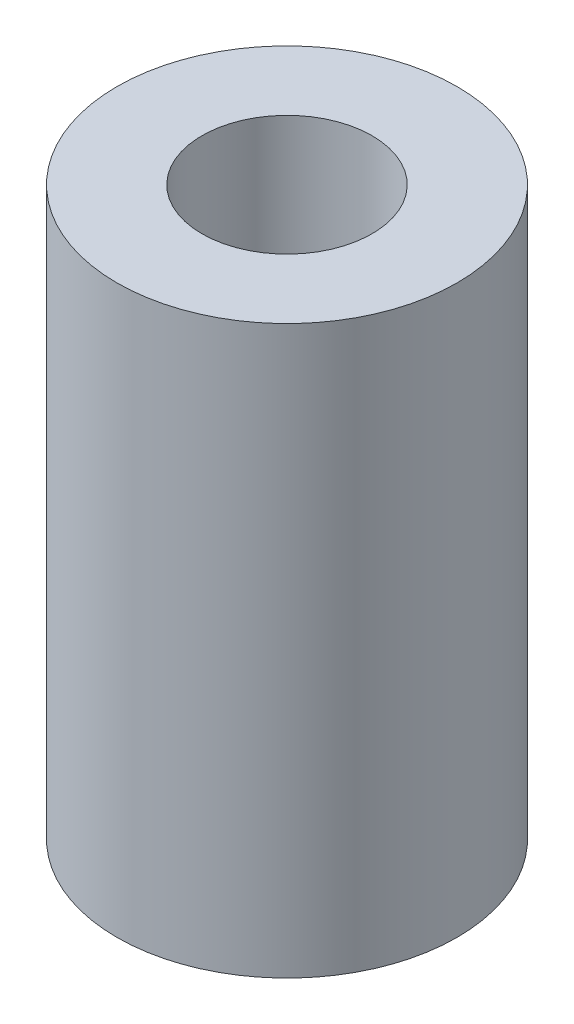
ISO-10303-21;
HEADER;
FILE_DESCRIPTION(('STEP AP214'),'2;1');
FILE_NAME('part.step','',(''),(''),'','','');
FILE_SCHEMA(('AUTOMOTIVE_DESIGN { 1 0 10303 214 1 1 1 1 }'));
ENDSEC;
DATA;
#1=APPLICATION_CONTEXT('core data for automotive mechanical design processes');
#2=APPLICATION_PROTOCOL_DEFINITION('international standard','automotive_design',2000,#1);
#3=PRODUCT_CONTEXT('',#1,'mechanical');
#4=PRODUCT('Part','Part','',(#3));
#5=PRODUCT_RELATED_PRODUCT_CATEGORY('part','',(#4));
#6=PRODUCT_DEFINITION_FORMATION('','',#4);
#7=PRODUCT_DEFINITION_CONTEXT('part definition',#1,'design');
#8=PRODUCT_DEFINITION('design','',#6,#7);
#9=PRODUCT_DEFINITION_SHAPE('','',#8);
#10=(LENGTH_UNIT() NAMED_UNIT(*) SI_UNIT(.MILLI.,.METRE.));
#11=(NAMED_UNIT(*) PLANE_ANGLE_UNIT() SI_UNIT($,.RADIAN.));
#12=(NAMED_UNIT(*) SI_UNIT($,.STERADIAN.) SOLID_ANGLE_UNIT());
#13=UNCERTAINTY_MEASURE_WITH_UNIT(LENGTH_MEASURE(1.E-05),#10,'distance_accuracy_value','');
#14=(GEOMETRIC_REPRESENTATION_CONTEXT(3) GLOBAL_UNCERTAINTY_ASSIGNED_CONTEXT((#13)) GLOBAL_UNIT_ASSIGNED_CONTEXT((#10,
#11,#12)) REPRESENTATION_CONTEXT('',''));
#15=CARTESIAN_POINT('',(0.,0.,0.));
#16=DIRECTION('',(0.,0.,1.));
#17=DIRECTION('',(1.,0.,0.));
#18=AXIS2_PLACEMENT_3D('',#15,#16,#17);
#19=CARTESIAN_POINT('',(0.,10.,0.));
#20=DIRECTION('',(0.,1.,0.));
#21=DIRECTION('',(0.,0.,1.));
#22=AXIS2_PLACEMENT_3D('',#19,#20,#21);
#23=PLANE('',#22);
#24=CARTESIAN_POINT('',(0.,10.,0.));
#25=DIRECTION('',(0.,1.,0.));
#26=DIRECTION('',(0.,0.,1.));
#27=AXIS2_PLACEMENT_3D('',#24,#25,#26);
#28=CIRCLE('',#27,3.);
#29=CARTESIAN_POINT('',(0.,10.,3.));
#30=VERTEX_POINT('',#29);
#31=EDGE_CURVE('E10',#30,#30,#28,.T.);
#32=ORIENTED_EDGE('',*,*,#31,.T.);
#33=EDGE_LOOP('',(#32));
#34=FACE_BOUND('',#33,.T.);
#35=CARTESIAN_POINT('',(0.,10.,0.));
#36=DIRECTION('',(0.,1.,0.));
#37=DIRECTION('',(0.,0.,1.));
#38=AXIS2_PLACEMENT_3D('',#35,#36,#37);
#39=CIRCLE('',#38,1.5);
#40=CARTESIAN_POINT('',(0.,10.,1.5));
#41=VERTEX_POINT('',#40);
#42=EDGE_CURVE('E50',#41,#41,#39,.T.);
#43=ORIENTED_EDGE('',*,*,#42,.F.);
#44=EDGE_LOOP('',(#43));
#45=FACE_BOUND('',#44,.T.);
#46=ADVANCED_FACE('F37',(#34,#45),#23,.T.);
#47=CARTESIAN_POINT('',(0.,0.,0.));
#48=DIRECTION('',(0.,1.,0.));
#49=DIRECTION('',(0.,0.,1.));
#50=AXIS2_PLACEMENT_3D('',#47,#48,#49);
#51=PLANE('',#50);
#52=CARTESIAN_POINT('',(0.,0.,0.));
#53=DIRECTION('',(0.,1.,0.));
#54=DIRECTION('',(0.,0.,1.));
#55=AXIS2_PLACEMENT_3D('',#52,#53,#54);
#56=CIRCLE('',#55,3.);
#57=CARTESIAN_POINT('',(0.,0.,3.));
#58=VERTEX_POINT('',#57);
#59=EDGE_CURVE('E41',#58,#58,#56,.T.);
#60=ORIENTED_EDGE('',*,*,#59,.F.);
#61=EDGE_LOOP('',(#60));
#62=FACE_BOUND('',#61,.T.);
#63=CARTESIAN_POINT('',(0.,0.,0.));
#64=DIRECTION('',(0.,1.,0.));
#65=DIRECTION('',(0.,0.,1.));
#66=AXIS2_PLACEMENT_3D('',#63,#64,#65);
#67=CIRCLE('',#66,1.5);
#68=CARTESIAN_POINT('',(0.,0.,1.5));
#69=VERTEX_POINT('',#68);
#70=EDGE_CURVE('E52',#69,#69,#67,.T.);
#71=ORIENTED_EDGE('',*,*,#70,.T.);
#72=EDGE_LOOP('',(#71));
#73=FACE_BOUND('',#72,.T.);
#74=ADVANCED_FACE('F64',(#62,#73),#51,.F.);
#75=CARTESIAN_POINT('',(0.,10.,0.));
#76=DIRECTION('',(0.,-1.,0.));
#77=DIRECTION('',(0.,0.,-1.));
#78=AXIS2_PLACEMENT_3D('',#75,#76,#77);
#79=CYLINDRICAL_SURFACE('',#78,3.);
#80=ORIENTED_EDGE('',*,*,#31,.F.);
#81=EDGE_LOOP('',(#80));
#82=FACE_BOUND('',#81,.T.);
#83=ORIENTED_EDGE('',*,*,#59,.T.);
#84=EDGE_LOOP('',(#83));
#85=FACE_BOUND('',#84,.T.);
#86=ADVANCED_FACE('F39',(#82,#85),#79,.T.);
#87=CARTESIAN_POINT('',(0.,10.,0.));
#88=DIRECTION('',(0.,-1.,0.));
#89=DIRECTION('',(0.,0.,-1.));
#90=AXIS2_PLACEMENT_3D('',#87,#88,#89);
#91=CYLINDRICAL_SURFACE('',#90,1.5);
#92=ORIENTED_EDGE('',*,*,#42,.T.);
#93=EDGE_LOOP('',(#92));
#94=FACE_BOUND('',#93,.T.);
#95=ORIENTED_EDGE('',*,*,#70,.F.);
#96=EDGE_LOOP('',(#95));
#97=FACE_BOUND('',#96,.T.);
#98=ADVANCED_FACE('F60',(#94,#97),#91,.F.);
#99=CLOSED_SHELL('',(#46,#74,#86,#98));
#100=MANIFOLD_SOLID_BREP('B2',#99);
#101=ADVANCED_BREP_SHAPE_REPRESENTATION('',(#18,#100),#14);
#102=SHAPE_DEFINITION_REPRESENTATION(#9,#101);
ENDSEC;
END-ISO-10303-21;
